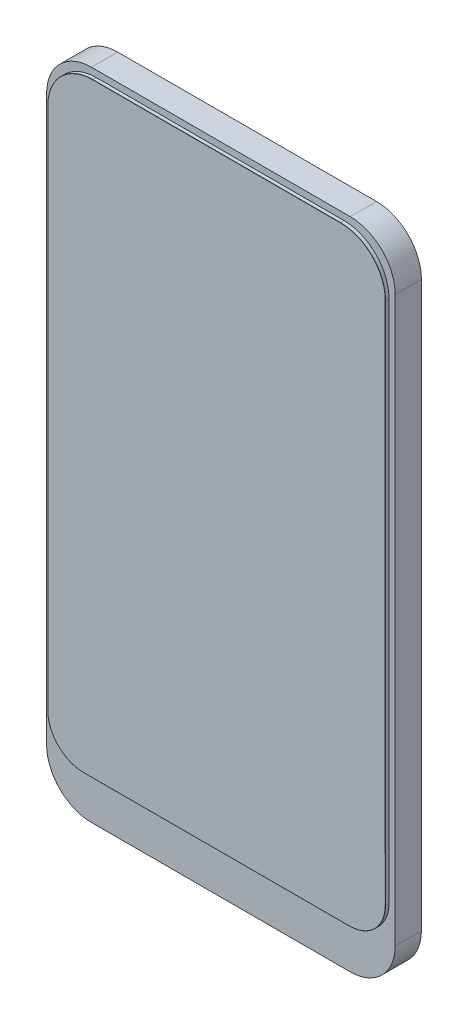
ISO-10303-21;
HEADER;
FILE_DESCRIPTION(('STEP AP214'),'2;1');
FILE_NAME('part.step','',(''),(''),'','','');
FILE_SCHEMA(('AUTOMOTIVE_DESIGN { 1 0 10303 214 1 1 1 1 }'));
ENDSEC;
DATA;
#1=APPLICATION_CONTEXT('core data for automotive mechanical design processes');
#2=APPLICATION_PROTOCOL_DEFINITION('international standard','automotive_design',2000,#1);
#3=PRODUCT_CONTEXT('',#1,'mechanical');
#4=PRODUCT('Part','Part','',(#3));
#5=PRODUCT_RELATED_PRODUCT_CATEGORY('part','',(#4));
#6=PRODUCT_DEFINITION_FORMATION('','',#4);
#7=PRODUCT_DEFINITION_CONTEXT('part definition',#1,'design');
#8=PRODUCT_DEFINITION('design','',#6,#7);
#9=PRODUCT_DEFINITION_SHAPE('','',#8);
#10=(LENGTH_UNIT() NAMED_UNIT(*) SI_UNIT(.MILLI.,.METRE.));
#11=(NAMED_UNIT(*) PLANE_ANGLE_UNIT() SI_UNIT($,.RADIAN.));
#12=(NAMED_UNIT(*) SI_UNIT($,.STERADIAN.) SOLID_ANGLE_UNIT());
#13=UNCERTAINTY_MEASURE_WITH_UNIT(LENGTH_MEASURE(1.E-05),#10,'distance_accuracy_value','');
#14=(GEOMETRIC_REPRESENTATION_CONTEXT(3) GLOBAL_UNCERTAINTY_ASSIGNED_CONTEXT((#13)) GLOBAL_UNIT_ASSIGNED_CONTEXT((#10,
#11,#12)) REPRESENTATION_CONTEXT('',''));
#15=CARTESIAN_POINT('',(0.,0.,0.));
#16=DIRECTION('',(0.,0.,1.));
#17=DIRECTION('',(1.,0.,0.));
#18=AXIS2_PLACEMENT_3D('',#15,#16,#17);
#19=CARTESIAN_POINT('',(7.23980986058282,-16.7061775952109,-1.46));
#20=DIRECTION('',(0.,0.,1.));
#21=DIRECTION('',(1.,0.,0.));
#22=AXIS2_PLACEMENT_3D('',#19,#20,#21);
#23=PLANE('',#22);
#24=CARTESIAN_POINT('',(7.23980986058282,-16.7061775952109,-1.46));
#25=DIRECTION('',(0.,0.,1.));
#26=DIRECTION('',(1.,0.,0.));
#27=AXIS2_PLACEMENT_3D('',#24,#25,#26);
#28=CIRCLE('',#27,2.5);
#29=CARTESIAN_POINT('',(7.2398098605828,-19.2061775952109,-1.46));
#30=VERTEX_POINT('',#29);
#31=CARTESIAN_POINT('',(9.73980986058282,-16.7061775952109,-1.46));
#32=VERTEX_POINT('',#31);
#33=EDGE_CURVE('E304',#30,#32,#28,.T.);
#34=ORIENTED_EDGE('',*,*,#33,.F.);
#35=DIRECTION('',(1.,0.,0.));
#36=VECTOR('',#35,1.);
#37=CARTESIAN_POINT('',(-7.15477532849782,-19.2061775952109,-1.46));
#38=LINE('',#37,#36);
#39=CARTESIAN_POINT('',(-7.15477532849782,-19.2061775952109,-1.46));
#40=VERTEX_POINT('',#39);
#41=EDGE_CURVE('E332',#40,#30,#38,.T.);
#42=ORIENTED_EDGE('',*,*,#41,.F.);
#43=CARTESIAN_POINT('',(-7.15477532849783,-16.7061775952109,-1.46));
#44=DIRECTION('',(0.,0.,1.));
#45=DIRECTION('',(-1.,0.,0.));
#46=AXIS2_PLACEMENT_3D('',#43,#44,#45);
#47=CIRCLE('',#46,2.5);
#48=CARTESIAN_POINT('',(-9.65477532849783,-16.7061775952109,-1.46));
#49=VERTEX_POINT('',#48);
#50=EDGE_CURVE('E329',#49,#40,#47,.T.);
#51=ORIENTED_EDGE('',*,*,#50,.F.);
#52=DIRECTION('',(0.,-1.,0.));
#53=VECTOR('',#52,1.);
#54=CARTESIAN_POINT('',(-9.65477532849783,-16.7061775952109,-1.46));
#55=LINE('',#54,#53);
#56=CARTESIAN_POINT('',(-9.65477532849783,14.6883533916669,-1.46));
#57=VERTEX_POINT('',#56);
#58=EDGE_CURVE('E325',#57,#49,#55,.T.);
#59=ORIENTED_EDGE('',*,*,#58,.F.);
#60=CARTESIAN_POINT('',(-7.15477532849783,14.6883533916669,-1.46));
#61=DIRECTION('',(0.,0.,1.));
#62=DIRECTION('',(-1.,0.,0.));
#63=AXIS2_PLACEMENT_3D('',#60,#61,#62);
#64=CIRCLE('',#63,2.5);
#65=CARTESIAN_POINT('',(-7.15477532849782,17.1883533916669,-1.46));
#66=VERTEX_POINT('',#65);
#67=EDGE_CURVE('E321',#66,#57,#64,.T.);
#68=ORIENTED_EDGE('',*,*,#67,.F.);
#69=DIRECTION('',(-1.,0.,0.));
#70=VECTOR('',#69,1.);
#71=CARTESIAN_POINT('',(-7.15477532849782,17.1883533916669,-1.46));
#72=LINE('',#71,#70);
#73=CARTESIAN_POINT('',(7.2398098605828,17.1883533916669,-1.46));
#74=VERTEX_POINT('',#73);
#75=EDGE_CURVE('E317',#74,#66,#72,.T.);
#76=ORIENTED_EDGE('',*,*,#75,.F.);
#77=CARTESIAN_POINT('',(7.23980986058282,14.6883533916669,-1.46));
#78=DIRECTION('',(0.,0.,1.));
#79=DIRECTION('',(-1.,0.,0.));
#80=AXIS2_PLACEMENT_3D('',#77,#78,#79);
#81=CIRCLE('',#80,2.5);
#82=CARTESIAN_POINT('',(9.73980986058282,14.6883533916669,-1.46));
#83=VERTEX_POINT('',#82);
#84=EDGE_CURVE('E313',#83,#74,#81,.T.);
#85=ORIENTED_EDGE('',*,*,#84,.F.);
#86=DIRECTION('',(0.,1.,0.));
#87=VECTOR('',#86,1.);
#88=CARTESIAN_POINT('',(9.73980986058282,-16.7061775952109,-1.46));
#89=LINE('',#88,#87);
#90=EDGE_CURVE('E308',#32,#83,#89,.T.);
#91=ORIENTED_EDGE('',*,*,#90,.F.);
#92=EDGE_LOOP('',(#34,#42,#51,#59,#68,#76,#85,#91));
#93=FACE_BOUND('',#92,.T.);
#94=DIRECTION('',(0.,-1.,0.));
#95=VECTOR('',#94,1.);
#96=CARTESIAN_POINT('',(4.96150246438309,-3.90854502558689,-1.46));
#97=LINE('',#96,#95);
#98=CARTESIAN_POINT('',(4.96150246438309,-3.90854502558689,-1.46));
#99=VERTEX_POINT('',#98);
#100=CARTESIAN_POINT('',(4.96150246438309,-5.90829608987389,-1.46));
#101=VERTEX_POINT('',#100);
#102=EDGE_CURVE('E233',#99,#101,#97,.T.);
#103=ORIENTED_EDGE('',*,*,#102,.F.);
#104=DIRECTION('',(1.,0.,0.));
#105=VECTOR('',#104,1.);
#106=CARTESIAN_POINT('',(4.96150246438309,-3.90854502558689,-1.46));
#107=LINE('',#106,#105);
#108=CARTESIAN_POINT('',(-4.82760452606745,-3.90854502558689,-1.46));
#109=VERTEX_POINT('',#108);
#110=EDGE_CURVE('E230',#109,#99,#107,.T.);
#111=ORIENTED_EDGE('',*,*,#110,.F.);
#112=DIRECTION('',(0.,1.,0.));
#113=VECTOR('',#112,1.);
#114=CARTESIAN_POINT('',(-4.82760452606745,-3.90854502558689,-1.46));
#115=LINE('',#114,#113);
#116=CARTESIAN_POINT('',(-4.82760452606745,-5.90829608987389,-1.46));
#117=VERTEX_POINT('',#116);
#118=EDGE_CURVE('E67',#117,#109,#115,.T.);
#119=ORIENTED_EDGE('',*,*,#118,.F.);
#120=DIRECTION('',(-1.,0.,0.));
#121=VECTOR('',#120,1.);
#122=CARTESIAN_POINT('',(4.96150246438309,-5.90829608987389,-1.46));
#123=LINE('',#122,#121);
#124=EDGE_CURVE('E62',#101,#117,#123,.T.);
#125=ORIENTED_EDGE('',*,*,#124,.F.);
#126=EDGE_LOOP('',(#103,#111,#119,#125));
#127=FACE_BOUND('',#126,.T.);
#128=ADVANCED_FACE('F44',(#93,#127),#23,.F.);
#129=CARTESIAN_POINT('',(7.395,-14.825,0.2));
#130=DIRECTION('',(0.,0.,-1.));
#131=DIRECTION('',(-1.,0.,0.));
#132=AXIS2_PLACEMENT_3D('',#129,#130,#131);
#133=CYLINDRICAL_SURFACE('',#132,2.);
#134=DIRECTION('',(0.,0.,-1.));
#135=VECTOR('',#134,1.);
#136=CARTESIAN_POINT('',(9.395,-14.825,0.2));
#137=LINE('',#136,#135);
#138=CARTESIAN_POINT('',(9.395,-14.825,0.19));
#139=VERTEX_POINT('',#138);
#140=CARTESIAN_POINT('',(9.395,-14.825,0.));
#141=VERTEX_POINT('',#140);
#142=EDGE_CURVE('E300',#139,#141,#137,.T.);
#143=ORIENTED_EDGE('',*,*,#142,.F.);
#144=CARTESIAN_POINT('',(7.395,-14.825,0.19));
#145=DIRECTION('',(0.,0.,1.));
#146=DIRECTION('',(1.,0.,0.));
#147=AXIS2_PLACEMENT_3D('',#144,#145,#146);
#148=CIRCLE('',#147,2.);
#149=CARTESIAN_POINT('',(7.39499999999999,-16.825,0.19));
#150=VERTEX_POINT('',#149);
#151=EDGE_CURVE('E418',#139,#150,#148,.F.);
#152=ORIENTED_EDGE('',*,*,#151,.T.);
#153=DIRECTION('',(0.,0.,-1.));
#154=VECTOR('',#153,1.);
#155=CARTESIAN_POINT('',(7.39499999999999,-16.825,0.2));
#156=LINE('',#155,#154);
#157=CARTESIAN_POINT('',(7.39499999999999,-16.825,0.));
#158=VERTEX_POINT('',#157);
#159=EDGE_CURVE('E279',#150,#158,#156,.T.);
#160=ORIENTED_EDGE('',*,*,#159,.T.);
#161=CARTESIAN_POINT('',(7.395,-14.825,0.));
#162=DIRECTION('',(0.,0.,1.));
#163=DIRECTION('',(1.,0.,0.));
#164=AXIS2_PLACEMENT_3D('',#161,#162,#163);
#165=CIRCLE('',#164,2.);
#166=EDGE_CURVE('E247',#158,#141,#165,.T.);
#167=ORIENTED_EDGE('',*,*,#166,.T.);
#168=EDGE_LOOP('',(#143,#152,#160,#167));
#169=FACE_BOUND('',#168,.T.);
#170=ADVANCED_FACE('F525',(#169),#133,.T.);
#171=CARTESIAN_POINT('',(9.395,-14.825,0.2));
#172=DIRECTION('',(-1.,0.,0.));
#173=DIRECTION('',(0.,0.,1.));
#174=AXIS2_PLACEMENT_3D('',#171,#172,#173);
#175=PLANE('',#174);
#176=DIRECTION('',(0.,0.,-1.));
#177=VECTOR('',#176,1.);
#178=CARTESIAN_POINT('',(9.395,14.325,0.2));
#179=LINE('',#178,#177);
#180=CARTESIAN_POINT('',(9.395,14.325,0.19));
#181=VERTEX_POINT('',#180);
#182=CARTESIAN_POINT('',(9.395,14.325,0.));
#183=VERTEX_POINT('',#182);
#184=EDGE_CURVE('E297',#181,#183,#179,.T.);
#185=ORIENTED_EDGE('',*,*,#184,.F.);
#186=DIRECTION('',(0.,1.,0.));
#187=VECTOR('',#186,1.);
#188=CARTESIAN_POINT('',(9.395,-14.825,0.19));
#189=LINE('',#188,#187);
#190=EDGE_CURVE('E414',#181,#139,#189,.F.);
#191=ORIENTED_EDGE('',*,*,#190,.T.);
#192=ORIENTED_EDGE('',*,*,#142,.T.);
#193=DIRECTION('',(0.,1.,0.));
#194=VECTOR('',#193,1.);
#195=CARTESIAN_POINT('',(9.395,-14.825,0.));
#196=LINE('',#195,#194);
#197=EDGE_CURVE('E251',#141,#183,#196,.T.);
#198=ORIENTED_EDGE('',*,*,#197,.T.);
#199=EDGE_LOOP('',(#185,#191,#192,#198));
#200=FACE_BOUND('',#199,.T.);
#201=ADVANCED_FACE('F521',(#200),#175,.F.);
#202=CARTESIAN_POINT('',(6.895,14.325,0.2));
#203=DIRECTION('',(0.,0.,-1.));
#204=DIRECTION('',(-1.,0.,0.));
#205=AXIS2_PLACEMENT_3D('',#202,#203,#204);
#206=CYLINDRICAL_SURFACE('',#205,2.5);
#207=DIRECTION('',(0.,0.,-1.));
#208=VECTOR('',#207,1.);
#209=CARTESIAN_POINT('',(6.89499999999998,16.825,0.2));
#210=LINE('',#209,#208);
#211=CARTESIAN_POINT('',(6.89499999999998,16.825,0.19));
#212=VERTEX_POINT('',#211);
#213=CARTESIAN_POINT('',(6.89499999999998,16.825,0.));
#214=VERTEX_POINT('',#213);
#215=EDGE_CURVE('E294',#212,#214,#210,.T.);
#216=ORIENTED_EDGE('',*,*,#215,.F.);
#217=CARTESIAN_POINT('',(6.895,14.325,0.19));
#218=DIRECTION('',(0.,0.,1.));
#219=DIRECTION('',(1.,0.,0.));
#220=AXIS2_PLACEMENT_3D('',#217,#218,#219);
#221=CIRCLE('',#220,2.5);
#222=EDGE_CURVE('E11',#212,#181,#221,.F.);
#223=ORIENTED_EDGE('',*,*,#222,.T.);
#224=ORIENTED_EDGE('',*,*,#184,.T.);
#225=CARTESIAN_POINT('',(6.895,14.325,0.));
#226=DIRECTION('',(0.,0.,1.));
#227=DIRECTION('',(-1.,0.,0.));
#228=AXIS2_PLACEMENT_3D('',#225,#226,#227);
#229=CIRCLE('',#228,2.5);
#230=EDGE_CURVE('E255',#183,#214,#229,.T.);
#231=ORIENTED_EDGE('',*,*,#230,.T.);
#232=EDGE_LOOP('',(#216,#223,#224,#231));
#233=FACE_BOUND('',#232,.T.);
#234=ADVANCED_FACE('F517',(#233),#206,.T.);
#235=CARTESIAN_POINT('',(-6.89499999999998,16.825,0.2));
#236=DIRECTION('',(0.,-1.,0.));
#237=DIRECTION('',(0.,0.,-1.));
#238=AXIS2_PLACEMENT_3D('',#235,#236,#237);
#239=PLANE('',#238);
#240=DIRECTION('',(0.,0.,-1.));
#241=VECTOR('',#240,1.);
#242=CARTESIAN_POINT('',(-6.89499999999998,16.825,0.2));
#243=LINE('',#242,#241);
#244=CARTESIAN_POINT('',(-6.89499999999998,16.825,0.19));
#245=VERTEX_POINT('',#244);
#246=CARTESIAN_POINT('',(-6.89499999999998,16.825,0.));
#247=VERTEX_POINT('',#246);
#248=EDGE_CURVE('E291',#245,#247,#243,.T.);
#249=ORIENTED_EDGE('',*,*,#248,.F.);
#250=DIRECTION('',(-1.,0.,0.));
#251=VECTOR('',#250,1.);
#252=CARTESIAN_POINT('',(6.89499999999998,16.825,0.19));
#253=LINE('',#252,#251);
#254=EDGE_CURVE('E54',#245,#212,#253,.F.);
#255=ORIENTED_EDGE('',*,*,#254,.T.);
#256=ORIENTED_EDGE('',*,*,#215,.T.);
#257=DIRECTION('',(-1.,0.,0.));
#258=VECTOR('',#257,1.);
#259=CARTESIAN_POINT('',(-6.89499999999998,16.825,0.));
#260=LINE('',#259,#258);
#261=EDGE_CURVE('E259',#214,#247,#260,.T.);
#262=ORIENTED_EDGE('',*,*,#261,.T.);
#263=EDGE_LOOP('',(#249,#255,#256,#262));
#264=FACE_BOUND('',#263,.T.);
#265=ADVANCED_FACE('F515',(#264),#239,.F.);
#266=CARTESIAN_POINT('',(-6.895,14.325,0.2));
#267=DIRECTION('',(0.,0.,-1.));
#268=DIRECTION('',(-1.,0.,0.));
#269=AXIS2_PLACEMENT_3D('',#266,#267,#268);
#270=CYLINDRICAL_SURFACE('',#269,2.5);
#271=DIRECTION('',(0.,0.,-1.));
#272=VECTOR('',#271,1.);
#273=CARTESIAN_POINT('',(-9.395,14.325,0.2));
#274=LINE('',#273,#272);
#275=CARTESIAN_POINT('',(-9.395,14.325,0.19));
#276=VERTEX_POINT('',#275);
#277=CARTESIAN_POINT('',(-9.395,14.325,0.));
#278=VERTEX_POINT('',#277);
#279=EDGE_CURVE('E288',#276,#278,#274,.T.);
#280=ORIENTED_EDGE('',*,*,#279,.F.);
#281=CARTESIAN_POINT('',(-6.895,14.325,0.19));
#282=DIRECTION('',(0.,0.,1.));
#283=DIRECTION('',(1.,0.,0.));
#284=AXIS2_PLACEMENT_3D('',#281,#282,#283);
#285=CIRCLE('',#284,2.5);
#286=EDGE_CURVE('E430',#276,#245,#285,.F.);
#287=ORIENTED_EDGE('',*,*,#286,.T.);
#288=ORIENTED_EDGE('',*,*,#248,.T.);
#289=CARTESIAN_POINT('',(-6.895,14.325,0.));
#290=DIRECTION('',(0.,0.,1.));
#291=DIRECTION('',(-1.,0.,0.));
#292=AXIS2_PLACEMENT_3D('',#289,#290,#291);
#293=CIRCLE('',#292,2.5);
#294=EDGE_CURVE('E263',#247,#278,#293,.T.);
#295=ORIENTED_EDGE('',*,*,#294,.T.);
#296=EDGE_LOOP('',(#280,#287,#288,#295));
#297=FACE_BOUND('',#296,.T.);
#298=ADVANCED_FACE('F475',(#297),#270,.T.);
#299=CARTESIAN_POINT('',(-9.395,-14.825,0.2));
#300=DIRECTION('',(1.,0.,0.));
#301=DIRECTION('',(0.,0.,-1.));
#302=AXIS2_PLACEMENT_3D('',#299,#300,#301);
#303=PLANE('',#302);
#304=DIRECTION('',(0.,0.,-1.));
#305=VECTOR('',#304,1.);
#306=CARTESIAN_POINT('',(-9.395,-14.825,0.2));
#307=LINE('',#306,#305);
#308=CARTESIAN_POINT('',(-9.395,-14.825,0.19));
#309=VERTEX_POINT('',#308);
#310=CARTESIAN_POINT('',(-9.395,-14.825,0.));
#311=VERTEX_POINT('',#310);
#312=EDGE_CURVE('E285',#309,#311,#307,.T.);
#313=ORIENTED_EDGE('',*,*,#312,.F.);
#314=DIRECTION('',(0.,-1.,0.));
#315=VECTOR('',#314,1.);
#316=CARTESIAN_POINT('',(-9.395,14.325,0.19));
#317=LINE('',#316,#315);
#318=EDGE_CURVE('E427',#309,#276,#317,.F.);
#319=ORIENTED_EDGE('',*,*,#318,.T.);
#320=ORIENTED_EDGE('',*,*,#279,.T.);
#321=DIRECTION('',(0.,-1.,0.));
#322=VECTOR('',#321,1.);
#323=CARTESIAN_POINT('',(-9.395,-14.825,0.));
#324=LINE('',#323,#322);
#325=EDGE_CURVE('E267',#278,#311,#324,.T.);
#326=ORIENTED_EDGE('',*,*,#325,.T.);
#327=EDGE_LOOP('',(#313,#319,#320,#326));
#328=FACE_BOUND('',#327,.T.);
#329=ADVANCED_FACE('F473',(#328),#303,.F.);
#330=CARTESIAN_POINT('',(-7.395,-14.825,0.2));
#331=DIRECTION('',(0.,0.,-1.));
#332=DIRECTION('',(-1.,0.,0.));
#333=AXIS2_PLACEMENT_3D('',#330,#331,#332);
#334=CYLINDRICAL_SURFACE('',#333,2.);
#335=DIRECTION('',(0.,0.,-1.));
#336=VECTOR('',#335,1.);
#337=CARTESIAN_POINT('',(-7.39499999999998,-16.825,0.2));
#338=LINE('',#337,#336);
#339=CARTESIAN_POINT('',(-7.39499999999998,-16.825,0.19));
#340=VERTEX_POINT('',#339);
#341=CARTESIAN_POINT('',(-7.39499999999998,-16.825,0.));
#342=VERTEX_POINT('',#341);
#343=EDGE_CURVE('E282',#340,#342,#338,.T.);
#344=ORIENTED_EDGE('',*,*,#343,.F.);
#345=CARTESIAN_POINT('',(-7.395,-14.825,0.19));
#346=DIRECTION('',(0.,0.,1.));
#347=DIRECTION('',(1.,0.,0.));
#348=AXIS2_PLACEMENT_3D('',#345,#346,#347);
#349=CIRCLE('',#348,2.);
#350=EDGE_CURVE('E424',#340,#309,#349,.F.);
#351=ORIENTED_EDGE('',*,*,#350,.T.);
#352=ORIENTED_EDGE('',*,*,#312,.T.);
#353=CARTESIAN_POINT('',(-7.395,-14.825,0.));
#354=DIRECTION('',(0.,0.,1.));
#355=DIRECTION('',(-1.,0.,0.));
#356=AXIS2_PLACEMENT_3D('',#353,#354,#355);
#357=CIRCLE('',#356,2.);
#358=EDGE_CURVE('E271',#311,#342,#357,.T.);
#359=ORIENTED_EDGE('',*,*,#358,.T.);
#360=EDGE_LOOP('',(#344,#351,#352,#359));
#361=FACE_BOUND('',#360,.T.);
#362=ADVANCED_FACE('F488',(#361),#334,.T.);
#363=CARTESIAN_POINT('',(-7.39499999999998,-16.825,0.2));
#364=DIRECTION('',(0.,1.,0.));
#365=DIRECTION('',(0.,0.,1.));
#366=AXIS2_PLACEMENT_3D('',#363,#364,#365);
#367=PLANE('',#366);
#368=ORIENTED_EDGE('',*,*,#159,.F.);
#369=DIRECTION('',(1.,0.,0.));
#370=VECTOR('',#369,1.);
#371=CARTESIAN_POINT('',(-7.39499999999998,-16.825,0.19));
#372=LINE('',#371,#370);
#373=EDGE_CURVE('E421',#150,#340,#372,.F.);
#374=ORIENTED_EDGE('',*,*,#373,.T.);
#375=ORIENTED_EDGE('',*,*,#343,.T.);
#376=DIRECTION('',(1.,0.,0.));
#377=VECTOR('',#376,1.);
#378=CARTESIAN_POINT('',(-7.39499999999998,-16.825,0.));
#379=LINE('',#378,#377);
#380=EDGE_CURVE('E275',#342,#158,#379,.T.);
#381=ORIENTED_EDGE('',*,*,#380,.T.);
#382=EDGE_LOOP('',(#368,#374,#375,#381));
#383=FACE_BOUND('',#382,.T.);
#384=ADVANCED_FACE('F491',(#383),#367,.F.);
#385=CARTESIAN_POINT('',(7.395,-14.825,0.2));
#386=DIRECTION('',(0.,0.,1.));
#387=DIRECTION('',(1.,0.,0.));
#388=AXIS2_PLACEMENT_3D('',#385,#386,#387);
#389=PLANE('',#388);
#390=CARTESIAN_POINT('',(7.395,-14.825,0.2));
#391=DIRECTION('',(0.,0.,1.));
#392=DIRECTION('',(1.,0.,0.));
#393=AXIS2_PLACEMENT_3D('',#390,#391,#392);
#394=CIRCLE('',#393,1.99);
#395=CARTESIAN_POINT('',(7.39499999999999,-16.815,0.2));
#396=VERTEX_POINT('',#395);
#397=CARTESIAN_POINT('',(9.385,-14.825,0.2));
#398=VERTEX_POINT('',#397);
#399=EDGE_CURVE('E407',#396,#398,#394,.T.);
#400=ORIENTED_EDGE('',*,*,#399,.T.);
#401=DIRECTION('',(0.,1.,0.));
#402=VECTOR('',#401,1.);
#403=CARTESIAN_POINT('',(9.385,14.325,0.2));
#404=LINE('',#403,#402);
#405=CARTESIAN_POINT('',(9.385,14.325,0.2));
#406=VERTEX_POINT('',#405);
#407=EDGE_CURVE('E410',#398,#406,#404,.T.);
#408=ORIENTED_EDGE('',*,*,#407,.T.);
#409=CARTESIAN_POINT('',(6.895,14.325,0.2));
#410=DIRECTION('',(0.,0.,1.));
#411=DIRECTION('',(1.,0.,0.));
#412=AXIS2_PLACEMENT_3D('',#409,#410,#411);
#413=CIRCLE('',#412,2.49);
#414=CARTESIAN_POINT('',(6.89499999999998,16.815,0.2));
#415=VERTEX_POINT('',#414);
#416=EDGE_CURVE('E370',#406,#415,#413,.T.);
#417=ORIENTED_EDGE('',*,*,#416,.T.);
#418=DIRECTION('',(-1.,0.,0.));
#419=VECTOR('',#418,1.);
#420=CARTESIAN_POINT('',(-6.89499999999998,16.815,0.2));
#421=LINE('',#420,#419);
#422=CARTESIAN_POINT('',(-6.89499999999998,16.815,0.2));
#423=VERTEX_POINT('',#422);
#424=EDGE_CURVE('E392',#415,#423,#421,.T.);
#425=ORIENTED_EDGE('',*,*,#424,.T.);
#426=CARTESIAN_POINT('',(-6.895,14.325,0.2));
#427=DIRECTION('',(0.,0.,1.));
#428=DIRECTION('',(1.,0.,0.));
#429=AXIS2_PLACEMENT_3D('',#426,#427,#428);
#430=CIRCLE('',#429,2.49);
#431=CARTESIAN_POINT('',(-9.38499999999999,14.325,0.2));
#432=VERTEX_POINT('',#431);
#433=EDGE_CURVE('E395',#423,#432,#430,.T.);
#434=ORIENTED_EDGE('',*,*,#433,.T.);
#435=DIRECTION('',(0.,-1.,0.));
#436=VECTOR('',#435,1.);
#437=CARTESIAN_POINT('',(-9.38499999999999,-14.825,0.2));
#438=LINE('',#437,#436);
#439=CARTESIAN_POINT('',(-9.38499999999999,-14.825,0.2));
#440=VERTEX_POINT('',#439);
#441=EDGE_CURVE('E398',#432,#440,#438,.T.);
#442=ORIENTED_EDGE('',*,*,#441,.T.);
#443=CARTESIAN_POINT('',(-7.395,-14.825,0.2));
#444=DIRECTION('',(0.,0.,1.));
#445=DIRECTION('',(1.,0.,0.));
#446=AXIS2_PLACEMENT_3D('',#443,#444,#445);
#447=CIRCLE('',#446,1.99);
#448=CARTESIAN_POINT('',(-7.39499999999998,-16.815,0.2));
#449=VERTEX_POINT('',#448);
#450=EDGE_CURVE('E401',#440,#449,#447,.T.);
#451=ORIENTED_EDGE('',*,*,#450,.T.);
#452=DIRECTION('',(1.,0.,0.));
#453=VECTOR('',#452,1.);
#454=CARTESIAN_POINT('',(7.39499999999999,-16.815,0.2));
#455=LINE('',#454,#453);
#456=EDGE_CURVE('E404',#449,#396,#455,.T.);
#457=ORIENTED_EDGE('',*,*,#456,.T.);
#458=EDGE_LOOP('',(#400,#408,#417,#425,#434,#442,#451,#457));
#459=FACE_BOUND('',#458,.T.);
#460=ADVANCED_FACE('F504',(#459),#389,.T.);
#461=CARTESIAN_POINT('',(7.23980986058282,-16.7061775952109,0.));
#462=DIRECTION('',(0.,0.,1.));
#463=DIRECTION('',(1.,0.,0.));
#464=AXIS2_PLACEMENT_3D('',#461,#462,#463);
#465=PLANE('',#464);
#466=CARTESIAN_POINT('',(7.23980986058282,-16.7061775952109,0.));
#467=DIRECTION('',(0.,0.,1.));
#468=DIRECTION('',(1.,0.,0.));
#469=AXIS2_PLACEMENT_3D('',#466,#467,#468);
#470=CIRCLE('',#469,2.5);
#471=CARTESIAN_POINT('',(7.2398098605828,-19.2061775952109,0.));
#472=VERTEX_POINT('',#471);
#473=CARTESIAN_POINT('',(9.73980986058282,-16.7061775952109,0.));
#474=VERTEX_POINT('',#473);
#475=EDGE_CURVE('E303',#472,#474,#470,.T.);
#476=ORIENTED_EDGE('',*,*,#475,.T.);
#477=DIRECTION('',(0.,1.,0.));
#478=VECTOR('',#477,1.);
#479=CARTESIAN_POINT('',(9.73980986058282,-16.7061775952109,0.));
#480=LINE('',#479,#478);
#481=CARTESIAN_POINT('',(9.73980986058282,14.6883533916669,0.));
#482=VERTEX_POINT('',#481);
#483=EDGE_CURVE('E340',#474,#482,#480,.T.);
#484=ORIENTED_EDGE('',*,*,#483,.T.);
#485=CARTESIAN_POINT('',(7.23980986058282,14.6883533916669,0.));
#486=DIRECTION('',(0.,0.,1.));
#487=DIRECTION('',(-1.,0.,0.));
#488=AXIS2_PLACEMENT_3D('',#485,#486,#487);
#489=CIRCLE('',#488,2.5);
#490=CARTESIAN_POINT('',(7.2398098605828,17.1883533916669,0.));
#491=VERTEX_POINT('',#490);
#492=EDGE_CURVE('E344',#482,#491,#489,.T.);
#493=ORIENTED_EDGE('',*,*,#492,.T.);
#494=DIRECTION('',(-1.,0.,0.));
#495=VECTOR('',#494,1.);
#496=CARTESIAN_POINT('',(-7.15477532849782,17.1883533916669,0.));
#497=LINE('',#496,#495);
#498=CARTESIAN_POINT('',(-7.15477532849782,17.1883533916669,0.));
#499=VERTEX_POINT('',#498);
#500=EDGE_CURVE('E348',#491,#499,#497,.T.);
#501=ORIENTED_EDGE('',*,*,#500,.T.);
#502=CARTESIAN_POINT('',(-7.15477532849783,14.6883533916669,0.));
#503=DIRECTION('',(0.,0.,1.));
#504=DIRECTION('',(-1.,0.,0.));
#505=AXIS2_PLACEMENT_3D('',#502,#503,#504);
#506=CIRCLE('',#505,2.5);
#507=CARTESIAN_POINT('',(-9.65477532849783,14.6883533916669,0.));
#508=VERTEX_POINT('',#507);
#509=EDGE_CURVE('E352',#499,#508,#506,.T.);
#510=ORIENTED_EDGE('',*,*,#509,.T.);
#511=DIRECTION('',(0.,-1.,0.));
#512=VECTOR('',#511,1.);
#513=CARTESIAN_POINT('',(-9.65477532849783,-16.7061775952109,0.));
#514=LINE('',#513,#512);
#515=CARTESIAN_POINT('',(-9.65477532849783,-16.7061775952109,0.));
#516=VERTEX_POINT('',#515);
#517=EDGE_CURVE('E356',#508,#516,#514,.T.);
#518=ORIENTED_EDGE('',*,*,#517,.T.);
#519=CARTESIAN_POINT('',(-7.15477532849783,-16.7061775952109,0.));
#520=DIRECTION('',(0.,0.,1.));
#521=DIRECTION('',(-1.,0.,0.));
#522=AXIS2_PLACEMENT_3D('',#519,#520,#521);
#523=CIRCLE('',#522,2.5);
#524=CARTESIAN_POINT('',(-7.15477532849782,-19.2061775952109,0.));
#525=VERTEX_POINT('',#524);
#526=EDGE_CURVE('E360',#516,#525,#523,.T.);
#527=ORIENTED_EDGE('',*,*,#526,.T.);
#528=DIRECTION('',(1.,0.,0.));
#529=VECTOR('',#528,1.);
#530=CARTESIAN_POINT('',(-7.15477532849782,-19.2061775952109,0.));
#531=LINE('',#530,#529);
#532=EDGE_CURVE('E309',#525,#472,#531,.T.);
#533=ORIENTED_EDGE('',*,*,#532,.T.);
#534=EDGE_LOOP('',(#476,#484,#493,#501,#510,#518,#527,#533));
#535=FACE_BOUND('',#534,.T.);
#536=ORIENTED_EDGE('',*,*,#197,.F.);
#537=ORIENTED_EDGE('',*,*,#166,.F.);
#538=ORIENTED_EDGE('',*,*,#380,.F.);
#539=ORIENTED_EDGE('',*,*,#358,.F.);
#540=ORIENTED_EDGE('',*,*,#325,.F.);
#541=ORIENTED_EDGE('',*,*,#294,.F.);
#542=ORIENTED_EDGE('',*,*,#261,.F.);
#543=ORIENTED_EDGE('',*,*,#230,.F.);
#544=EDGE_LOOP('',(#536,#537,#538,#539,#540,#541,#542,#543));
#545=FACE_BOUND('',#544,.T.);
#546=ADVANCED_FACE('F483',(#535,#545),#465,.T.);
#547=CARTESIAN_POINT('',(7.23980986058282,-16.7061775952109,-1.46));
#548=DIRECTION('',(0.,0.,1.));
#549=DIRECTION('',(1.,0.,0.));
#550=AXIS2_PLACEMENT_3D('',#547,#548,#549);
#551=CYLINDRICAL_SURFACE('',#550,2.5);
#552=ORIENTED_EDGE('',*,*,#475,.F.);
#553=DIRECTION('',(0.,0.,1.));
#554=VECTOR('',#553,1.);
#555=CARTESIAN_POINT('',(7.2398098605828,-19.2061775952109,-1.46));
#556=LINE('',#555,#554);
#557=EDGE_CURVE('E367',#30,#472,#556,.T.);
#558=ORIENTED_EDGE('',*,*,#557,.F.);
#559=ORIENTED_EDGE('',*,*,#33,.T.);
#560=DIRECTION('',(0.,0.,1.));
#561=VECTOR('',#560,1.);
#562=CARTESIAN_POINT('',(9.73980986058282,-16.7061775952109,-1.46));
#563=LINE('',#562,#561);
#564=EDGE_CURVE('E336',#32,#474,#563,.T.);
#565=ORIENTED_EDGE('',*,*,#564,.T.);
#566=EDGE_LOOP('',(#552,#558,#559,#565));
#567=FACE_BOUND('',#566,.T.);
#568=ADVANCED_FACE('F539',(#567),#551,.T.);
#569=CARTESIAN_POINT('',(-7.15477532849782,-19.2061775952109,-1.46));
#570=DIRECTION('',(0.,-1.,0.));
#571=DIRECTION('',(0.,0.,-1.));
#572=AXIS2_PLACEMENT_3D('',#569,#570,#571);
#573=PLANE('',#572);
#574=ORIENTED_EDGE('',*,*,#532,.F.);
#575=DIRECTION('',(0.,0.,1.));
#576=VECTOR('',#575,1.);
#577=CARTESIAN_POINT('',(-7.15477532849782,-19.2061775952109,-1.46));
#578=LINE('',#577,#576);
#579=EDGE_CURVE('E371',#40,#525,#578,.T.);
#580=ORIENTED_EDGE('',*,*,#579,.F.);
#581=ORIENTED_EDGE('',*,*,#41,.T.);
#582=ORIENTED_EDGE('',*,*,#557,.T.);
#583=EDGE_LOOP('',(#574,#580,#581,#582));
#584=FACE_BOUND('',#583,.T.);
#585=ADVANCED_FACE('F541',(#584),#573,.T.);
#586=CARTESIAN_POINT('',(-7.15477532849783,-16.7061775952109,-1.46));
#587=DIRECTION('',(0.,0.,1.));
#588=DIRECTION('',(1.,0.,0.));
#589=AXIS2_PLACEMENT_3D('',#586,#587,#588);
#590=CYLINDRICAL_SURFACE('',#589,2.5);
#591=ORIENTED_EDGE('',*,*,#526,.F.);
#592=DIRECTION('',(0.,0.,1.));
#593=VECTOR('',#592,1.);
#594=CARTESIAN_POINT('',(-9.65477532849783,-16.7061775952109,-1.46));
#595=LINE('',#594,#593);
#596=EDGE_CURVE('E374',#49,#516,#595,.T.);
#597=ORIENTED_EDGE('',*,*,#596,.F.);
#598=ORIENTED_EDGE('',*,*,#50,.T.);
#599=ORIENTED_EDGE('',*,*,#579,.T.);
#600=EDGE_LOOP('',(#591,#597,#598,#599));
#601=FACE_BOUND('',#600,.T.);
#602=ADVANCED_FACE('F544',(#601),#590,.T.);
#603=CARTESIAN_POINT('',(-9.65477532849783,-16.7061775952109,-1.46));
#604=DIRECTION('',(-1.,0.,0.));
#605=DIRECTION('',(0.,0.,1.));
#606=AXIS2_PLACEMENT_3D('',#603,#604,#605);
#607=PLANE('',#606);
#608=ORIENTED_EDGE('',*,*,#517,.F.);
#609=DIRECTION('',(0.,0.,1.));
#610=VECTOR('',#609,1.);
#611=CARTESIAN_POINT('',(-9.65477532849783,14.6883533916669,-1.46));
#612=LINE('',#611,#610);
#613=EDGE_CURVE('E377',#57,#508,#612,.T.);
#614=ORIENTED_EDGE('',*,*,#613,.F.);
#615=ORIENTED_EDGE('',*,*,#58,.T.);
#616=ORIENTED_EDGE('',*,*,#596,.T.);
#617=EDGE_LOOP('',(#608,#614,#615,#616));
#618=FACE_BOUND('',#617,.T.);
#619=ADVANCED_FACE('F548',(#618),#607,.T.);
#620=CARTESIAN_POINT('',(-7.15477532849783,14.6883533916669,-1.46));
#621=DIRECTION('',(0.,0.,1.));
#622=DIRECTION('',(1.,0.,0.));
#623=AXIS2_PLACEMENT_3D('',#620,#621,#622);
#624=CYLINDRICAL_SURFACE('',#623,2.5);
#625=ORIENTED_EDGE('',*,*,#509,.F.);
#626=DIRECTION('',(0.,0.,1.));
#627=VECTOR('',#626,1.);
#628=CARTESIAN_POINT('',(-7.15477532849782,17.1883533916669,-1.46));
#629=LINE('',#628,#627);
#630=EDGE_CURVE('E380',#66,#499,#629,.T.);
#631=ORIENTED_EDGE('',*,*,#630,.F.);
#632=ORIENTED_EDGE('',*,*,#67,.T.);
#633=ORIENTED_EDGE('',*,*,#613,.T.);
#634=EDGE_LOOP('',(#625,#631,#632,#633));
#635=FACE_BOUND('',#634,.T.);
#636=ADVANCED_FACE('F552',(#635),#624,.T.);
#637=CARTESIAN_POINT('',(-7.15477532849782,17.1883533916669,-1.46));
#638=DIRECTION('',(0.,1.,0.));
#639=DIRECTION('',(0.,0.,1.));
#640=AXIS2_PLACEMENT_3D('',#637,#638,#639);
#641=PLANE('',#640);
#642=ORIENTED_EDGE('',*,*,#500,.F.);
#643=DIRECTION('',(0.,0.,1.));
#644=VECTOR('',#643,1.);
#645=CARTESIAN_POINT('',(7.2398098605828,17.1883533916669,-1.46));
#646=LINE('',#645,#644);
#647=EDGE_CURVE('E383',#74,#491,#646,.T.);
#648=ORIENTED_EDGE('',*,*,#647,.F.);
#649=ORIENTED_EDGE('',*,*,#75,.T.);
#650=ORIENTED_EDGE('',*,*,#630,.T.);
#651=EDGE_LOOP('',(#642,#648,#649,#650));
#652=FACE_BOUND('',#651,.T.);
#653=ADVANCED_FACE('F556',(#652),#641,.T.);
#654=CARTESIAN_POINT('',(7.23980986058282,14.6883533916669,-1.46));
#655=DIRECTION('',(0.,0.,1.));
#656=DIRECTION('',(1.,0.,0.));
#657=AXIS2_PLACEMENT_3D('',#654,#655,#656);
#658=CYLINDRICAL_SURFACE('',#657,2.5);
#659=ORIENTED_EDGE('',*,*,#492,.F.);
#660=DIRECTION('',(0.,0.,1.));
#661=VECTOR('',#660,1.);
#662=CARTESIAN_POINT('',(9.73980986058282,14.6883533916669,-1.46));
#663=LINE('',#662,#661);
#664=EDGE_CURVE('E386',#83,#482,#663,.T.);
#665=ORIENTED_EDGE('',*,*,#664,.F.);
#666=ORIENTED_EDGE('',*,*,#84,.T.);
#667=ORIENTED_EDGE('',*,*,#647,.T.);
#668=EDGE_LOOP('',(#659,#665,#666,#667));
#669=FACE_BOUND('',#668,.T.);
#670=ADVANCED_FACE('F560',(#669),#658,.T.);
#671=CARTESIAN_POINT('',(9.73980986058282,-16.7061775952109,-1.46));
#672=DIRECTION('',(1.,0.,0.));
#673=DIRECTION('',(0.,0.,-1.));
#674=AXIS2_PLACEMENT_3D('',#671,#672,#673);
#675=PLANE('',#674);
#676=ORIENTED_EDGE('',*,*,#483,.F.);
#677=ORIENTED_EDGE('',*,*,#564,.F.);
#678=ORIENTED_EDGE('',*,*,#90,.T.);
#679=ORIENTED_EDGE('',*,*,#664,.T.);
#680=EDGE_LOOP('',(#676,#677,#678,#679));
#681=FACE_BOUND('',#680,.T.);
#682=ADVANCED_FACE('F564',(#681),#675,.T.);
#683=CARTESIAN_POINT('',(-9.38499999999999,-14.825,0.19));
#684=DIRECTION('',(0.,1.,0.));
#685=DIRECTION('',(0.,0.,1.));
#686=AXIS2_PLACEMENT_3D('',#683,#684,#685);
#687=CYLINDRICAL_SURFACE('',#686,0.01);
#688=CARTESIAN_POINT('',(-9.385,14.325,0.19));
#689=DIRECTION('',(0.,1.,0.));
#690=DIRECTION('',(0.,0.,1.));
#691=AXIS2_PLACEMENT_3D('',#688,#689,#690);
#692=CIRCLE('',#691,0.01);
#693=EDGE_CURVE('E452',#276,#432,#692,.T.);
#694=ORIENTED_EDGE('',*,*,#693,.F.);
#695=ORIENTED_EDGE('',*,*,#318,.F.);
#696=CARTESIAN_POINT('',(-9.38499999999999,-14.825,0.19));
#697=DIRECTION('',(0.,-1.,0.));
#698=DIRECTION('',(0.,0.,-1.));
#699=AXIS2_PLACEMENT_3D('',#696,#697,#698);
#700=CIRCLE('',#699,0.01);
#701=EDGE_CURVE('E48',#440,#309,#700,.T.);
#702=ORIENTED_EDGE('',*,*,#701,.F.);
#703=ORIENTED_EDGE('',*,*,#441,.F.);
#704=EDGE_LOOP('',(#694,#695,#702,#703));
#705=FACE_BOUND('',#704,.T.);
#706=ADVANCED_FACE('F46',(#705),#687,.T.);
#707=CARTESIAN_POINT('',(-7.395,-14.825,0.19));
#708=DIRECTION('',(0.,0.,1.));
#709=DIRECTION('',(1.,0.,0.));
#710=AXIS2_PLACEMENT_3D('',#707,#708,#709);
#711=TOROIDAL_SURFACE('',#710,1.99,0.01);
#712=ORIENTED_EDGE('',*,*,#701,.T.);
#713=ORIENTED_EDGE('',*,*,#350,.F.);
#714=CARTESIAN_POINT('',(-7.39499999999998,-16.815,0.19));
#715=DIRECTION('',(1.,0.,0.));
#716=DIRECTION('',(0.,0.,-1.));
#717=AXIS2_PLACEMENT_3D('',#714,#715,#716);
#718=CIRCLE('',#717,0.01);
#719=EDGE_CURVE('E449',#449,#340,#718,.T.);
#720=ORIENTED_EDGE('',*,*,#719,.F.);
#721=ORIENTED_EDGE('',*,*,#450,.F.);
#722=EDGE_LOOP('',(#712,#713,#720,#721));
#723=FACE_BOUND('',#722,.T.);
#724=ADVANCED_FACE('F465',(#723),#711,.T.);
#725=CARTESIAN_POINT('',(-6.895,14.325,0.19));
#726=DIRECTION('',(0.,0.,1.));
#727=DIRECTION('',(1.,0.,0.));
#728=AXIS2_PLACEMENT_3D('',#725,#726,#727);
#729=TOROIDAL_SURFACE('',#728,2.49,0.01);
#730=ORIENTED_EDGE('',*,*,#693,.T.);
#731=ORIENTED_EDGE('',*,*,#433,.F.);
#732=CARTESIAN_POINT('',(-6.89499999999998,16.815,0.19));
#733=DIRECTION('',(1.,0.,0.));
#734=DIRECTION('',(0.,0.,-1.));
#735=AXIS2_PLACEMENT_3D('',#732,#733,#734);
#736=CIRCLE('',#735,0.01);
#737=EDGE_CURVE('E445',#245,#423,#736,.T.);
#738=ORIENTED_EDGE('',*,*,#737,.F.);
#739=ORIENTED_EDGE('',*,*,#286,.F.);
#740=EDGE_LOOP('',(#730,#731,#738,#739));
#741=FACE_BOUND('',#740,.T.);
#742=ADVANCED_FACE('F507',(#741),#729,.T.);
#743=CARTESIAN_POINT('',(7.395,-16.815,0.19));
#744=DIRECTION('',(-1.,0.,0.));
#745=DIRECTION('',(0.,0.,1.));
#746=AXIS2_PLACEMENT_3D('',#743,#744,#745);
#747=CYLINDRICAL_SURFACE('',#746,0.01);
#748=ORIENTED_EDGE('',*,*,#719,.T.);
#749=ORIENTED_EDGE('',*,*,#373,.F.);
#750=CARTESIAN_POINT('',(7.39499999999999,-16.815,0.19));
#751=DIRECTION('',(1.,0.,0.));
#752=DIRECTION('',(0.,0.,-1.));
#753=AXIS2_PLACEMENT_3D('',#750,#751,#752);
#754=CIRCLE('',#753,0.01);
#755=EDGE_CURVE('E441',#396,#150,#754,.T.);
#756=ORIENTED_EDGE('',*,*,#755,.F.);
#757=ORIENTED_EDGE('',*,*,#456,.F.);
#758=EDGE_LOOP('',(#748,#749,#756,#757));
#759=FACE_BOUND('',#758,.T.);
#760=ADVANCED_FACE('F495',(#759),#747,.T.);
#761=CARTESIAN_POINT('',(7.395,16.815,0.19));
#762=DIRECTION('',(1.,0.,0.));
#763=DIRECTION('',(0.,0.,-1.));
#764=AXIS2_PLACEMENT_3D('',#761,#762,#763);
#765=CYLINDRICAL_SURFACE('',#764,0.01);
#766=ORIENTED_EDGE('',*,*,#737,.T.);
#767=ORIENTED_EDGE('',*,*,#424,.F.);
#768=CARTESIAN_POINT('',(6.89499999999998,16.815,0.19));
#769=DIRECTION('',(1.,0.,0.));
#770=DIRECTION('',(0.,0.,-1.));
#771=AXIS2_PLACEMENT_3D('',#768,#769,#770);
#772=CIRCLE('',#771,0.01);
#773=EDGE_CURVE('E437',#212,#415,#772,.T.);
#774=ORIENTED_EDGE('',*,*,#773,.F.);
#775=ORIENTED_EDGE('',*,*,#254,.F.);
#776=EDGE_LOOP('',(#766,#767,#774,#775));
#777=FACE_BOUND('',#776,.T.);
#778=ADVANCED_FACE('F510',(#777),#765,.T.);
#779=CARTESIAN_POINT('',(7.395,-14.825,0.19));
#780=DIRECTION('',(0.,0.,1.));
#781=DIRECTION('',(1.,0.,0.));
#782=AXIS2_PLACEMENT_3D('',#779,#780,#781);
#783=TOROIDAL_SURFACE('',#782,1.99,0.01);
#784=ORIENTED_EDGE('',*,*,#755,.T.);
#785=ORIENTED_EDGE('',*,*,#151,.F.);
#786=CARTESIAN_POINT('',(9.385,-14.825,0.19));
#787=DIRECTION('',(0.,1.,0.));
#788=DIRECTION('',(0.,0.,1.));
#789=AXIS2_PLACEMENT_3D('',#786,#787,#788);
#790=CIRCLE('',#789,0.01);
#791=EDGE_CURVE('E240',#398,#139,#790,.T.);
#792=ORIENTED_EDGE('',*,*,#791,.F.);
#793=ORIENTED_EDGE('',*,*,#399,.F.);
#794=EDGE_LOOP('',(#784,#785,#792,#793));
#795=FACE_BOUND('',#794,.T.);
#796=ADVANCED_FACE('F500',(#795),#783,.T.);
#797=CARTESIAN_POINT('',(6.895,14.325,0.19));
#798=DIRECTION('',(0.,0.,1.));
#799=DIRECTION('',(1.,0.,0.));
#800=AXIS2_PLACEMENT_3D('',#797,#798,#799);
#801=TOROIDAL_SURFACE('',#800,2.49,0.01);
#802=ORIENTED_EDGE('',*,*,#773,.T.);
#803=ORIENTED_EDGE('',*,*,#416,.F.);
#804=CARTESIAN_POINT('',(9.385,14.325,0.19));
#805=DIRECTION('',(0.,-1.,0.));
#806=DIRECTION('',(0.,0.,-1.));
#807=AXIS2_PLACEMENT_3D('',#804,#805,#806);
#808=CIRCLE('',#807,0.01);
#809=EDGE_CURVE('E235',#181,#406,#808,.T.);
#810=ORIENTED_EDGE('',*,*,#809,.F.);
#811=ORIENTED_EDGE('',*,*,#222,.F.);
#812=EDGE_LOOP('',(#802,#803,#810,#811));
#813=FACE_BOUND('',#812,.T.);
#814=ADVANCED_FACE('F575',(#813),#801,.T.);
#815=CARTESIAN_POINT('',(9.385,-14.825,0.19));
#816=DIRECTION('',(0.,-1.,0.));
#817=DIRECTION('',(0.,0.,-1.));
#818=AXIS2_PLACEMENT_3D('',#815,#816,#817);
#819=CYLINDRICAL_SURFACE('',#818,0.01);
#820=ORIENTED_EDGE('',*,*,#791,.T.);
#821=ORIENTED_EDGE('',*,*,#190,.F.);
#822=ORIENTED_EDGE('',*,*,#809,.T.);
#823=ORIENTED_EDGE('',*,*,#407,.F.);
#824=EDGE_LOOP('',(#820,#821,#822,#823));
#825=FACE_BOUND('',#824,.T.);
#826=ADVANCED_FACE('F572',(#825),#819,.T.);
#827=CARTESIAN_POINT('',(4.96150246438309,-3.90854502558689,-1.66));
#828=DIRECTION('',(-1.,0.,0.));
#829=DIRECTION('',(0.,0.,1.));
#830=AXIS2_PLACEMENT_3D('',#827,#828,#829);
#831=PLANE('',#830);
#832=ORIENTED_EDGE('',*,*,#102,.T.);
#833=DIRECTION('',(0.,0.,1.));
#834=VECTOR('',#833,1.);
#835=CARTESIAN_POINT('',(4.96150246438309,-5.90829608987389,-1.66));
#836=LINE('',#835,#834);
#837=CARTESIAN_POINT('',(4.96150246438309,-5.90829608987389,-1.66));
#838=VERTEX_POINT('',#837);
#839=EDGE_CURVE('E212',#838,#101,#836,.T.);
#840=ORIENTED_EDGE('',*,*,#839,.F.);
#841=DIRECTION('',(0.,-1.,0.));
#842=VECTOR('',#841,1.);
#843=CARTESIAN_POINT('',(4.96150246438309,-3.90854502558689,-1.66));
#844=LINE('',#843,#842);
#845=CARTESIAN_POINT('',(4.96150246438309,-3.90854502558689,-1.66));
#846=VERTEX_POINT('',#845);
#847=EDGE_CURVE('E220',#846,#838,#844,.T.);
#848=ORIENTED_EDGE('',*,*,#847,.F.);
#849=DIRECTION('',(0.,0.,1.));
#850=VECTOR('',#849,1.);
#851=CARTESIAN_POINT('',(4.96150246438309,-3.90854502558689,-1.66));
#852=LINE('',#851,#850);
#853=EDGE_CURVE('E864',#846,#99,#852,.T.);
#854=ORIENTED_EDGE('',*,*,#853,.T.);
#855=EDGE_LOOP('',(#832,#840,#848,#854));
#856=FACE_BOUND('',#855,.T.);
#857=ADVANCED_FACE('F232',(#856),#831,.F.);
#858=CARTESIAN_POINT('',(4.96150246438309,-5.90829608987389,-1.66));
#859=DIRECTION('',(0.,1.,0.));
#860=DIRECTION('',(0.,0.,1.));
#861=AXIS2_PLACEMENT_3D('',#858,#859,#860);
#862=PLANE('',#861);
#863=ORIENTED_EDGE('',*,*,#124,.T.);
#864=DIRECTION('',(0.,0.,1.));
#865=VECTOR('',#864,1.);
#866=CARTESIAN_POINT('',(-4.82760452606745,-5.90829608987389,-1.66));
#867=LINE('',#866,#865);
#868=CARTESIAN_POINT('',(-4.82760452606745,-5.90829608987389,-1.66));
#869=VERTEX_POINT('',#868);
#870=EDGE_CURVE('E215',#869,#117,#867,.T.);
#871=ORIENTED_EDGE('',*,*,#870,.F.);
#872=DIRECTION('',(-1.,0.,0.));
#873=VECTOR('',#872,1.);
#874=CARTESIAN_POINT('',(4.96150246438309,-5.90829608987389,-1.66));
#875=LINE('',#874,#873);
#876=EDGE_CURVE('E208',#838,#869,#875,.T.);
#877=ORIENTED_EDGE('',*,*,#876,.F.);
#878=ORIENTED_EDGE('',*,*,#839,.T.);
#879=EDGE_LOOP('',(#863,#871,#877,#878));
#880=FACE_BOUND('',#879,.T.);
#881=ADVANCED_FACE('F210',(#880),#862,.F.);
#882=CARTESIAN_POINT('',(-4.82760452606745,-3.90854502558689,-1.66));
#883=DIRECTION('',(1.,0.,0.));
#884=DIRECTION('',(0.,0.,-1.));
#885=AXIS2_PLACEMENT_3D('',#882,#883,#884);
#886=PLANE('',#885);
#887=ORIENTED_EDGE('',*,*,#118,.T.);
#888=DIRECTION('',(0.,0.,1.));
#889=VECTOR('',#888,1.);
#890=CARTESIAN_POINT('',(-4.82760452606745,-3.90854502558689,-1.66));
#891=LINE('',#890,#889);
#892=CARTESIAN_POINT('',(-4.82760452606745,-3.90854502558689,-1.66));
#893=VERTEX_POINT('',#892);
#894=EDGE_CURVE('E243',#893,#109,#891,.T.);
#895=ORIENTED_EDGE('',*,*,#894,.F.);
#896=DIRECTION('',(0.,1.,0.));
#897=VECTOR('',#896,1.);
#898=CARTESIAN_POINT('',(-4.82760452606745,-3.90854502558689,-1.66));
#899=LINE('',#898,#897);
#900=EDGE_CURVE('E219',#869,#893,#899,.T.);
#901=ORIENTED_EDGE('',*,*,#900,.F.);
#902=ORIENTED_EDGE('',*,*,#870,.T.);
#903=EDGE_LOOP('',(#887,#895,#901,#902));
#904=FACE_BOUND('',#903,.T.);
#905=ADVANCED_FACE('F821',(#904),#886,.F.);
#906=CARTESIAN_POINT('',(4.96150246438309,-3.90854502558689,-1.66));
#907=DIRECTION('',(0.,-1.,0.));
#908=DIRECTION('',(0.,0.,-1.));
#909=AXIS2_PLACEMENT_3D('',#906,#907,#908);
#910=PLANE('',#909);
#911=ORIENTED_EDGE('',*,*,#110,.T.);
#912=ORIENTED_EDGE('',*,*,#853,.F.);
#913=DIRECTION('',(1.,0.,0.));
#914=VECTOR('',#913,1.);
#915=CARTESIAN_POINT('',(4.96150246438309,-3.90854502558689,-1.66));
#916=LINE('',#915,#914);
#917=EDGE_CURVE('E225',#893,#846,#916,.T.);
#918=ORIENTED_EDGE('',*,*,#917,.F.);
#919=ORIENTED_EDGE('',*,*,#894,.T.);
#920=EDGE_LOOP('',(#911,#912,#918,#919));
#921=FACE_BOUND('',#920,.T.);
#922=ADVANCED_FACE('F830',(#921),#910,.F.);
#923=CARTESIAN_POINT('',(0.,0.,-1.66));
#924=DIRECTION('',(0.,0.,-1.));
#925=DIRECTION('',(-1.,0.,0.));
#926=AXIS2_PLACEMENT_3D('',#923,#924,#925);
#927=PLANE('',#926);
#928=ORIENTED_EDGE('',*,*,#847,.T.);
#929=ORIENTED_EDGE('',*,*,#876,.T.);
#930=ORIENTED_EDGE('',*,*,#900,.T.);
#931=ORIENTED_EDGE('',*,*,#917,.T.);
#932=EDGE_LOOP('',(#928,#929,#930,#931));
#933=FACE_BOUND('',#932,.T.);
#934=ADVANCED_FACE('F223',(#933),#927,.T.);
#935=CLOSED_SHELL('',(#128,#170,#201,#234,#265,#298,#329,#362,#384,#460,#546,#568,#585,#602,
#619,#636,#653,#670,#682,#706,#724,#742,#760,#778,#796,#814,#826,#857,#881,#905,#922,#934));
#936=MANIFOLD_SOLID_BREP('B2',#935);
#937=ADVANCED_BREP_SHAPE_REPRESENTATION('',(#18,#936),#14);
#938=SHAPE_DEFINITION_REPRESENTATION(#9,#937);
ENDSEC;
END-ISO-10303-21;
